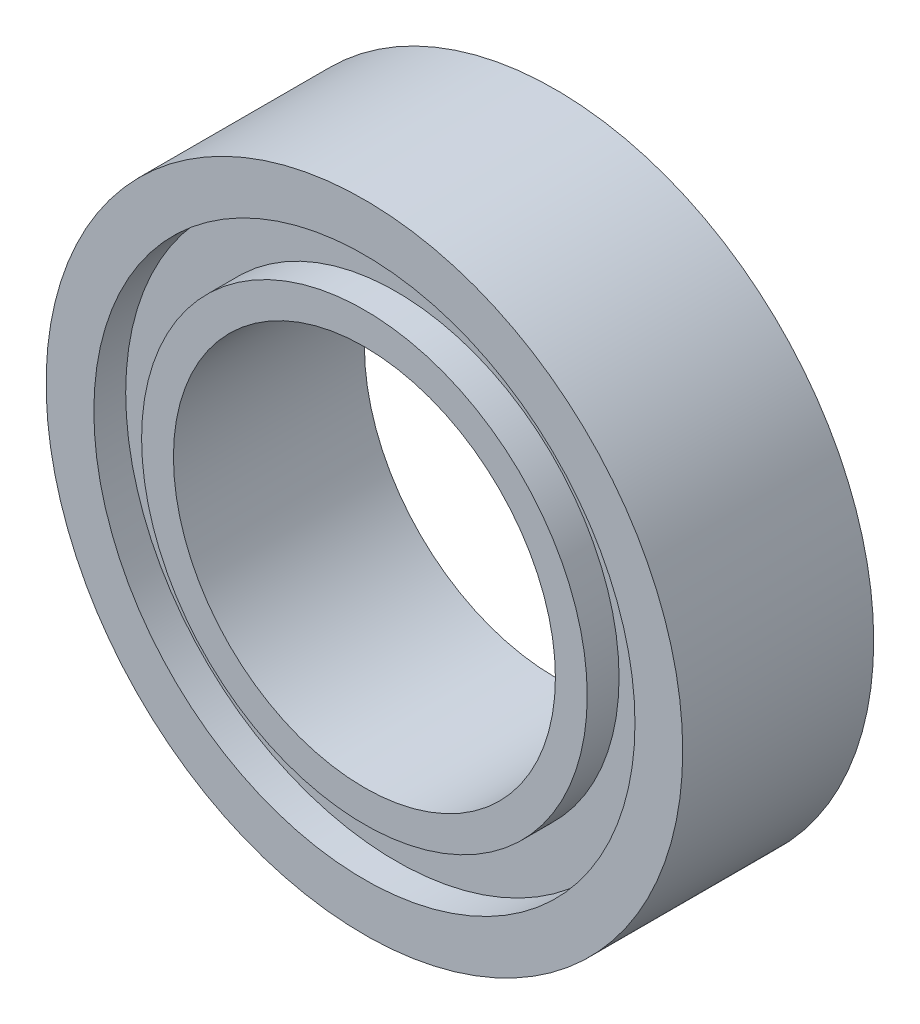
ISO-10303-21;
HEADER;
FILE_DESCRIPTION(('STEP AP214'),'2;1');
FILE_NAME('part.step','',(''),(''),'','','');
FILE_SCHEMA(('AUTOMOTIVE_DESIGN { 1 0 10303 214 1 1 1 1 }'));
ENDSEC;
DATA;
#1=APPLICATION_CONTEXT('core data for automotive mechanical design processes');
#2=APPLICATION_PROTOCOL_DEFINITION('international standard','automotive_design',2000,#1);
#3=PRODUCT_CONTEXT('',#1,'mechanical');
#4=PRODUCT('Part','Part','',(#3));
#5=PRODUCT_RELATED_PRODUCT_CATEGORY('part','',(#4));
#6=PRODUCT_DEFINITION_FORMATION('','',#4);
#7=PRODUCT_DEFINITION_CONTEXT('part definition',#1,'design');
#8=PRODUCT_DEFINITION('design','',#6,#7);
#9=PRODUCT_DEFINITION_SHAPE('','',#8);
#10=(LENGTH_UNIT() NAMED_UNIT(*) SI_UNIT(.MILLI.,.METRE.));
#11=(NAMED_UNIT(*) PLANE_ANGLE_UNIT() SI_UNIT($,.RADIAN.));
#12=(NAMED_UNIT(*) SI_UNIT($,.STERADIAN.) SOLID_ANGLE_UNIT());
#13=UNCERTAINTY_MEASURE_WITH_UNIT(LENGTH_MEASURE(1.E-05),#10,'distance_accuracy_value','');
#14=(GEOMETRIC_REPRESENTATION_CONTEXT(3) GLOBAL_UNCERTAINTY_ASSIGNED_CONTEXT((#13)) GLOBAL_UNIT_ASSIGNED_CONTEXT((#10,
#11,#12)) REPRESENTATION_CONTEXT('',''));
#15=CARTESIAN_POINT('',(0.,0.,0.));
#16=DIRECTION('',(0.,0.,1.));
#17=DIRECTION('',(1.,0.,0.));
#18=AXIS2_PLACEMENT_3D('',#15,#16,#17);
#19=CARTESIAN_POINT('',(0.,0.,0.));
#20=DIRECTION('',(0.,0.,1.));
#21=DIRECTION('',(1.,0.,0.));
#22=AXIS2_PLACEMENT_3D('',#19,#20,#21);
#23=PLANE('',#22);
#24=CARTESIAN_POINT('',(0.,0.,0.));
#25=DIRECTION('',(0.,0.,1.));
#26=DIRECTION('',(1.,0.,0.));
#27=AXIS2_PLACEMENT_3D('',#24,#25,#26);
#28=CIRCLE('',#27,3.);
#29=CARTESIAN_POINT('',(3.,0.,0.));
#30=VERTEX_POINT('',#29);
#31=EDGE_CURVE('E50',#30,#30,#28,.T.);
#32=ORIENTED_EDGE('',*,*,#31,.T.);
#33=EDGE_LOOP('',(#32));
#34=FACE_BOUND('',#33,.T.);
#35=CARTESIAN_POINT('',(0.,0.,0.));
#36=DIRECTION('',(0.,0.,1.));
#37=DIRECTION('',(1.,0.,0.));
#38=AXIS2_PLACEMENT_3D('',#35,#36,#37);
#39=CIRCLE('',#38,3.5);
#40=CARTESIAN_POINT('',(3.5,0.,0.));
#41=VERTEX_POINT('',#40);
#42=EDGE_CURVE('E74',#41,#41,#39,.T.);
#43=ORIENTED_EDGE('',*,*,#42,.F.);
#44=EDGE_LOOP('',(#43));
#45=FACE_BOUND('',#44,.T.);
#46=ADVANCED_FACE('F37',(#34,#45),#23,.F.);
#47=CARTESIAN_POINT('',(0.,0.,3.));
#48=DIRECTION('',(0.,0.,1.));
#49=DIRECTION('',(1.,0.,0.));
#50=AXIS2_PLACEMENT_3D('',#47,#48,#49);
#51=PLANE('',#50);
#52=CARTESIAN_POINT('',(0.,0.,3.));
#53=DIRECTION('',(0.,0.,1.));
#54=DIRECTION('',(1.,0.,0.));
#55=AXIS2_PLACEMENT_3D('',#52,#53,#54);
#56=CIRCLE('',#55,3.);
#57=CARTESIAN_POINT('',(3.,0.,3.));
#58=VERTEX_POINT('',#57);
#59=EDGE_CURVE('E48',#58,#58,#56,.T.);
#60=ORIENTED_EDGE('',*,*,#59,.F.);
#61=EDGE_LOOP('',(#60));
#62=FACE_BOUND('',#61,.T.);
#63=CARTESIAN_POINT('',(0.,0.,3.));
#64=DIRECTION('',(0.,0.,1.));
#65=DIRECTION('',(1.,0.,0.));
#66=AXIS2_PLACEMENT_3D('',#63,#64,#65);
#67=CIRCLE('',#66,3.5);
#68=CARTESIAN_POINT('',(3.5,0.,3.));
#69=VERTEX_POINT('',#68);
#70=EDGE_CURVE('E62',#69,#69,#67,.T.);
#71=ORIENTED_EDGE('',*,*,#70,.T.);
#72=EDGE_LOOP('',(#71));
#73=FACE_BOUND('',#72,.T.);
#74=ADVANCED_FACE('F90',(#62,#73),#51,.T.);
#75=CARTESIAN_POINT('',(0.,0.,3.));
#76=DIRECTION('',(0.,0.,1.));
#77=DIRECTION('',(1.,0.,0.));
#78=AXIS2_PLACEMENT_3D('',#75,#76,#77);
#79=CIRCLE('',#78,4.25);
#80=CARTESIAN_POINT('',(4.25,0.,3.));
#81=VERTEX_POINT('',#80);
#82=EDGE_CURVE('E56',#81,#81,#79,.T.);
#83=ORIENTED_EDGE('',*,*,#82,.F.);
#84=EDGE_LOOP('',(#83));
#85=FACE_BOUND('',#84,.T.);
#86=CARTESIAN_POINT('',(0.,0.,3.));
#87=DIRECTION('',(0.,0.,1.));
#88=DIRECTION('',(1.,0.,0.));
#89=AXIS2_PLACEMENT_3D('',#86,#87,#88);
#90=CIRCLE('',#89,5.);
#91=CARTESIAN_POINT('',(5.,0.,3.));
#92=VERTEX_POINT('',#91);
#93=EDGE_CURVE('E10',#92,#92,#90,.T.);
#94=ORIENTED_EDGE('',*,*,#93,.T.);
#95=EDGE_LOOP('',(#94));
#96=FACE_BOUND('',#95,.T.);
#97=ADVANCED_FACE('F98',(#85,#96),#51,.T.);
#98=CARTESIAN_POINT('',(0.,0.,0.));
#99=DIRECTION('',(0.,0.,1.));
#100=DIRECTION('',(1.,0.,0.));
#101=AXIS2_PLACEMENT_3D('',#98,#99,#100);
#102=CIRCLE('',#101,4.25);
#103=CARTESIAN_POINT('',(4.25,0.,0.));
#104=VERTEX_POINT('',#103);
#105=EDGE_CURVE('E68',#104,#104,#102,.T.);
#106=ORIENTED_EDGE('',*,*,#105,.T.);
#107=EDGE_LOOP('',(#106));
#108=FACE_BOUND('',#107,.T.);
#109=CARTESIAN_POINT('',(0.,0.,0.));
#110=DIRECTION('',(0.,0.,1.));
#111=DIRECTION('',(1.,0.,0.));
#112=AXIS2_PLACEMENT_3D('',#109,#110,#111);
#113=CIRCLE('',#112,5.);
#114=CARTESIAN_POINT('',(5.,0.,0.));
#115=VERTEX_POINT('',#114);
#116=EDGE_CURVE('E41',#115,#115,#113,.T.);
#117=ORIENTED_EDGE('',*,*,#116,.F.);
#118=EDGE_LOOP('',(#117));
#119=FACE_BOUND('',#118,.T.);
#120=ADVANCED_FACE('F92',(#108,#119),#23,.F.);
#121=CARTESIAN_POINT('',(0.,0.,3.));
#122=DIRECTION('',(0.,0.,-1.));
#123=DIRECTION('',(-1.,0.,0.));
#124=AXIS2_PLACEMENT_3D('',#121,#122,#123);
#125=CYLINDRICAL_SURFACE('',#124,5.);
#126=ORIENTED_EDGE('',*,*,#93,.F.);
#127=EDGE_LOOP('',(#126));
#128=FACE_BOUND('',#127,.T.);
#129=ORIENTED_EDGE('',*,*,#116,.T.);
#130=EDGE_LOOP('',(#129));
#131=FACE_BOUND('',#130,.T.);
#132=ADVANCED_FACE('F39',(#128,#131),#125,.T.);
#133=CARTESIAN_POINT('',(0.,0.,3.));
#134=DIRECTION('',(0.,0.,-1.));
#135=DIRECTION('',(-1.,0.,0.));
#136=AXIS2_PLACEMENT_3D('',#133,#134,#135);
#137=CYLINDRICAL_SURFACE('',#136,3.);
#138=ORIENTED_EDGE('',*,*,#59,.T.);
#139=EDGE_LOOP('',(#138));
#140=FACE_BOUND('',#139,.T.);
#141=ORIENTED_EDGE('',*,*,#31,.F.);
#142=EDGE_LOOP('',(#141));
#143=FACE_BOUND('',#142,.T.);
#144=ADVANCED_FACE('F106',(#140,#143),#137,.F.);
#145=CARTESIAN_POINT('',(0.,0.,2.5));
#146=DIRECTION('',(0.,0.,1.));
#147=DIRECTION('',(1.,0.,0.));
#148=AXIS2_PLACEMENT_3D('',#145,#146,#147);
#149=CYLINDRICAL_SURFACE('',#148,4.25);
#150=CARTESIAN_POINT('',(0.,0.,2.5));
#151=DIRECTION('',(0.,0.,1.));
#152=DIRECTION('',(1.,0.,0.));
#153=AXIS2_PLACEMENT_3D('',#150,#151,#152);
#154=CIRCLE('',#153,4.25);
#155=CARTESIAN_POINT('',(4.25,0.,2.5));
#156=VERTEX_POINT('',#155);
#157=EDGE_CURVE('E53',#156,#156,#154,.T.);
#158=ORIENTED_EDGE('',*,*,#157,.F.);
#159=EDGE_LOOP('',(#158));
#160=FACE_BOUND('',#159,.T.);
#161=ORIENTED_EDGE('',*,*,#82,.T.);
#162=EDGE_LOOP('',(#161));
#163=FACE_BOUND('',#162,.T.);
#164=ADVANCED_FACE('F129',(#160,#163),#149,.F.);
#165=CARTESIAN_POINT('',(0.,0.,2.5));
#166=DIRECTION('',(0.,0.,1.));
#167=DIRECTION('',(1.,0.,0.));
#168=AXIS2_PLACEMENT_3D('',#165,#166,#167);
#169=PLANE('',#168);
#170=CARTESIAN_POINT('',(0.,0.,2.5));
#171=DIRECTION('',(0.,0.,1.));
#172=DIRECTION('',(1.,0.,0.));
#173=AXIS2_PLACEMENT_3D('',#170,#171,#172);
#174=CIRCLE('',#173,3.5);
#175=CARTESIAN_POINT('',(3.5,0.,2.5));
#176=VERTEX_POINT('',#175);
#177=EDGE_CURVE('E59',#176,#176,#174,.T.);
#178=ORIENTED_EDGE('',*,*,#177,.F.);
#179=EDGE_LOOP('',(#178));
#180=FACE_BOUND('',#179,.T.);
#181=ORIENTED_EDGE('',*,*,#157,.T.);
#182=EDGE_LOOP('',(#181));
#183=FACE_BOUND('',#182,.T.);
#184=ADVANCED_FACE('F125',(#180,#183),#169,.T.);
#185=CARTESIAN_POINT('',(0.,0.,2.5));
#186=DIRECTION('',(0.,0.,1.));
#187=DIRECTION('',(1.,0.,0.));
#188=AXIS2_PLACEMENT_3D('',#185,#186,#187);
#189=CYLINDRICAL_SURFACE('',#188,3.5);
#190=ORIENTED_EDGE('',*,*,#177,.T.);
#191=EDGE_LOOP('',(#190));
#192=FACE_BOUND('',#191,.T.);
#193=ORIENTED_EDGE('',*,*,#70,.F.);
#194=EDGE_LOOP('',(#193));
#195=FACE_BOUND('',#194,.T.);
#196=ADVANCED_FACE('F120',(#192,#195),#189,.T.);
#197=CARTESIAN_POINT('',(0.,0.,0.5));
#198=DIRECTION('',(0.,0.,-1.));
#199=DIRECTION('',(1.,0.,0.));
#200=AXIS2_PLACEMENT_3D('',#197,#198,#199);
#201=PLANE('',#200);
#202=CARTESIAN_POINT('',(0.,0.,0.5));
#203=DIRECTION('',(0.,0.,1.));
#204=DIRECTION('',(1.,0.,0.));
#205=AXIS2_PLACEMENT_3D('',#202,#203,#204);
#206=CIRCLE('',#205,4.25);
#207=CARTESIAN_POINT('',(4.25,0.,0.5));
#208=VERTEX_POINT('',#207);
#209=EDGE_CURVE('E65',#208,#208,#206,.T.);
#210=ORIENTED_EDGE('',*,*,#209,.F.);
#211=EDGE_LOOP('',(#210));
#212=FACE_BOUND('',#211,.T.);
#213=CARTESIAN_POINT('',(0.,0.,0.5));
#214=DIRECTION('',(0.,0.,1.));
#215=DIRECTION('',(1.,0.,0.));
#216=AXIS2_PLACEMENT_3D('',#213,#214,#215);
#217=CIRCLE('',#216,3.5);
#218=CARTESIAN_POINT('',(3.5,0.,0.5));
#219=VERTEX_POINT('',#218);
#220=EDGE_CURVE('E71',#219,#219,#217,.T.);
#221=ORIENTED_EDGE('',*,*,#220,.T.);
#222=EDGE_LOOP('',(#221));
#223=FACE_BOUND('',#222,.T.);
#224=ADVANCED_FACE('F80',(#212,#223),#201,.T.);
#225=CARTESIAN_POINT('',(0.,0.,0.5));
#226=DIRECTION('',(0.,0.,-1.));
#227=DIRECTION('',(-1.,0.,0.));
#228=AXIS2_PLACEMENT_3D('',#225,#226,#227);
#229=CYLINDRICAL_SURFACE('',#228,4.25);
#230=ORIENTED_EDGE('',*,*,#209,.T.);
#231=EDGE_LOOP('',(#230));
#232=FACE_BOUND('',#231,.T.);
#233=ORIENTED_EDGE('',*,*,#105,.F.);
#234=EDGE_LOOP('',(#233));
#235=FACE_BOUND('',#234,.T.);
#236=ADVANCED_FACE('F85',(#232,#235),#229,.F.);
#237=CARTESIAN_POINT('',(0.,0.,0.5));
#238=DIRECTION('',(0.,0.,-1.));
#239=DIRECTION('',(-1.,0.,0.));
#240=AXIS2_PLACEMENT_3D('',#237,#238,#239);
#241=CYLINDRICAL_SURFACE('',#240,3.5);
#242=ORIENTED_EDGE('',*,*,#220,.F.);
#243=EDGE_LOOP('',(#242));
#244=FACE_BOUND('',#243,.T.);
#245=ORIENTED_EDGE('',*,*,#42,.T.);
#246=EDGE_LOOP('',(#245));
#247=FACE_BOUND('',#246,.T.);
#248=ADVANCED_FACE('F82',(#244,#247),#241,.T.);
#249=CLOSED_SHELL('',(#46,#74,#97,#120,#132,#144,#164,#184,#196,#224,#236,#248));
#250=MANIFOLD_SOLID_BREP('B2',#249);
#251=ADVANCED_BREP_SHAPE_REPRESENTATION('',(#18,#250),#14);
#252=SHAPE_DEFINITION_REPRESENTATION(#9,#251);
ENDSEC;
END-ISO-10303-21;
